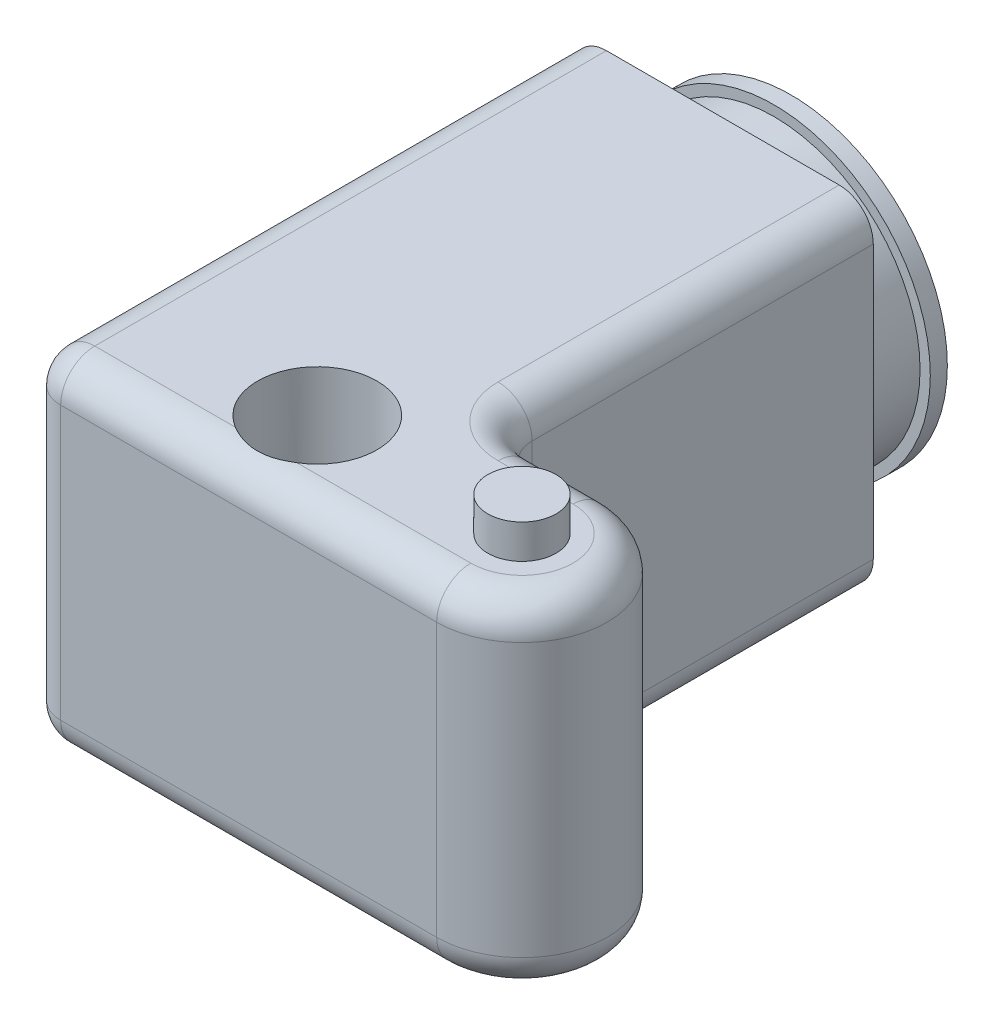
ISO-10303-21;
HEADER;
FILE_DESCRIPTION(('STEP AP214'),'2;1');
FILE_NAME('part.step','',(''),(''),'','','');
FILE_SCHEMA(('AUTOMOTIVE_DESIGN { 1 0 10303 214 1 1 1 1 }'));
ENDSEC;
DATA;
#1=APPLICATION_CONTEXT('core data for automotive mechanical design processes');
#2=APPLICATION_PROTOCOL_DEFINITION('international standard','automotive_design',2000,#1);
#3=PRODUCT_CONTEXT('',#1,'mechanical');
#4=PRODUCT('Part','Part','',(#3));
#5=PRODUCT_RELATED_PRODUCT_CATEGORY('part','',(#4));
#6=PRODUCT_DEFINITION_FORMATION('','',#4);
#7=PRODUCT_DEFINITION_CONTEXT('part definition',#1,'design');
#8=PRODUCT_DEFINITION('design','',#6,#7);
#9=PRODUCT_DEFINITION_SHAPE('','',#8);
#10=(LENGTH_UNIT() NAMED_UNIT(*) SI_UNIT(.MILLI.,.METRE.));
#11=(NAMED_UNIT(*) PLANE_ANGLE_UNIT() SI_UNIT($,.RADIAN.));
#12=(NAMED_UNIT(*) SI_UNIT($,.STERADIAN.) SOLID_ANGLE_UNIT());
#13=UNCERTAINTY_MEASURE_WITH_UNIT(LENGTH_MEASURE(1.E-05),#10,'distance_accuracy_value','');
#14=(GEOMETRIC_REPRESENTATION_CONTEXT(3) GLOBAL_UNCERTAINTY_ASSIGNED_CONTEXT((#13)) GLOBAL_UNIT_ASSIGNED_CONTEXT((#10,
#11,#12)) REPRESENTATION_CONTEXT('',''));
#15=CARTESIAN_POINT('',(0.,0.,0.));
#16=DIRECTION('',(0.,0.,1.));
#17=DIRECTION('',(1.,0.,0.));
#18=AXIS2_PLACEMENT_3D('',#15,#16,#17);
#19=CARTESIAN_POINT('',(70.2256728268984,50.,-10.391671092718));
#20=DIRECTION('',(0.,-1.,0.));
#21=DIRECTION('',(0.,0.,-1.));
#22=AXIS2_PLACEMENT_3D('',#19,#20,#21);
#23=CYLINDRICAL_SURFACE('',#22,25.);
#24=DIRECTION('',(0.,-1.,0.));
#25=VECTOR('',#24,1.);
#26=CARTESIAN_POINT('',(70.2256728268985,50.,14.608328907282));
#27=LINE('',#26,#25);
#28=CARTESIAN_POINT('',(70.2256728268985,-40.,14.608328907282));
#29=VERTEX_POINT('',#28);
#30=CARTESIAN_POINT('',(70.2256728268985,40.,14.608328907282));
#31=VERTEX_POINT('',#30);
#32=EDGE_CURVE('E188',#29,#31,#27,.F.);
#33=ORIENTED_EDGE('',*,*,#32,.F.);
#34=CARTESIAN_POINT('',(70.2256728268984,-40.,-10.391671092718));
#35=DIRECTION('',(0.,-1.,0.));
#36=DIRECTION('',(0.,0.,-1.));
#37=AXIS2_PLACEMENT_3D('',#34,#35,#36);
#38=CIRCLE('',#37,25.);
#39=CARTESIAN_POINT('',(70.2256728268983,-40.,-35.391671092718));
#40=VERTEX_POINT('',#39);
#41=EDGE_CURVE('E234',#29,#40,#38,.F.);
#42=ORIENTED_EDGE('',*,*,#41,.T.);
#43=DIRECTION('',(0.,-1.,0.));
#44=VECTOR('',#43,1.);
#45=CARTESIAN_POINT('',(70.2256728268983,50.,-35.391671092718));
#46=LINE('',#45,#44);
#47=CARTESIAN_POINT('',(70.2256728268983,40.,-35.391671092718));
#48=VERTEX_POINT('',#47);
#49=EDGE_CURVE('E408',#48,#40,#46,.T.);
#50=ORIENTED_EDGE('',*,*,#49,.F.);
#51=CARTESIAN_POINT('',(70.2256728268984,40.,-10.391671092718));
#52=DIRECTION('',(0.,-1.,0.));
#53=DIRECTION('',(0.,0.,-1.));
#54=AXIS2_PLACEMENT_3D('',#51,#52,#53);
#55=CIRCLE('',#54,25.);
#56=EDGE_CURVE('E232',#48,#31,#55,.T.);
#57=ORIENTED_EDGE('',*,*,#56,.T.);
#58=EDGE_LOOP('',(#33,#42,#50,#57));
#59=FACE_BOUND('',#58,.T.);
#60=ADVANCED_FACE('F38',(#59),#23,.T.);
#61=CARTESIAN_POINT('',(-50.,50.,-145.391671092718));
#62=DIRECTION('',(0.,0.,1.));
#63=DIRECTION('',(1.,0.,0.));
#64=AXIS2_PLACEMENT_3D('',#61,#62,#63);
#65=PLANE('',#64);
#66=CARTESIAN_POINT('',(-5.89036723285972,0.,-145.391671092718));
#67=DIRECTION('',(0.,0.,-1.));
#68=DIRECTION('',(-1.,0.,0.));
#69=AXIS2_PLACEMENT_3D('',#66,#67,#68);
#70=CIRCLE('',#69,42.828338);
#71=CARTESIAN_POINT('',(-48.7187052328597,0.,-145.391671092718));
#72=VERTEX_POINT('',#71);
#73=EDGE_CURVE('E405',#72,#72,#70,.T.);
#74=ORIENTED_EDGE('',*,*,#73,.F.);
#75=EDGE_LOOP('',(#74));
#76=FACE_BOUND('',#75,.T.);
#77=DIRECTION('',(0.,-1.,0.));
#78=VECTOR('',#77,1.);
#79=CARTESIAN_POINT('',(38.2192655342806,50.,-145.391671092718));
#80=LINE('',#79,#78);
#81=CARTESIAN_POINT('',(38.2192655342806,40.,-145.391671092718));
#82=VERTEX_POINT('',#81);
#83=CARTESIAN_POINT('',(38.2192655342806,-40.,-145.391671092718));
#84=VERTEX_POINT('',#83);
#85=EDGE_CURVE('E162',#82,#84,#80,.T.);
#86=ORIENTED_EDGE('',*,*,#85,.T.);
#87=CARTESIAN_POINT('',(28.2192655342806,-40.,-145.391671092718));
#88=DIRECTION('',(0.,0.,1.));
#89=DIRECTION('',(1.,0.,0.));
#90=AXIS2_PLACEMENT_3D('',#87,#88,#89);
#91=CIRCLE('',#90,10.);
#92=CARTESIAN_POINT('',(28.2192655342806,-50.,-145.391671092718));
#93=VERTEX_POINT('',#92);
#94=EDGE_CURVE('E168',#84,#93,#91,.F.);
#95=ORIENTED_EDGE('',*,*,#94,.T.);
#96=DIRECTION('',(-1.,0.,0.));
#97=VECTOR('',#96,1.);
#98=CARTESIAN_POINT('',(-50.,-50.,-145.391671092718));
#99=LINE('',#98,#97);
#100=CARTESIAN_POINT('',(-40.,-50.,-145.391671092718));
#101=VERTEX_POINT('',#100);
#102=EDGE_CURVE('E412',#93,#101,#99,.T.);
#103=ORIENTED_EDGE('',*,*,#102,.T.);
#104=CARTESIAN_POINT('',(-40.,-40.,-145.391671092718));
#105=DIRECTION('',(0.,0.,1.));
#106=DIRECTION('',(1.,0.,0.));
#107=AXIS2_PLACEMENT_3D('',#104,#105,#106);
#108=CIRCLE('',#107,10.);
#109=CARTESIAN_POINT('',(-50.,-40.,-145.391671092718));
#110=VERTEX_POINT('',#109);
#111=EDGE_CURVE('E169',#101,#110,#108,.F.);
#112=ORIENTED_EDGE('',*,*,#111,.T.);
#113=DIRECTION('',(0.,-1.,0.));
#114=VECTOR('',#113,1.);
#115=CARTESIAN_POINT('',(-50.,50.,-145.391671092718));
#116=LINE('',#115,#114);
#117=CARTESIAN_POINT('',(-50.,40.,-145.391671092718));
#118=VERTEX_POINT('',#117);
#119=EDGE_CURVE('E178',#118,#110,#116,.T.);
#120=ORIENTED_EDGE('',*,*,#119,.F.);
#121=CARTESIAN_POINT('',(-40.,40.,-145.391671092718));
#122=DIRECTION('',(0.,0.,1.));
#123=DIRECTION('',(1.,0.,0.));
#124=AXIS2_PLACEMENT_3D('',#121,#122,#123);
#125=CIRCLE('',#124,10.);
#126=CARTESIAN_POINT('',(-40.,50.,-145.391671092718));
#127=VERTEX_POINT('',#126);
#128=EDGE_CURVE('E186',#118,#127,#125,.F.);
#129=ORIENTED_EDGE('',*,*,#128,.T.);
#130=DIRECTION('',(-1.,0.,0.));
#131=VECTOR('',#130,1.);
#132=CARTESIAN_POINT('',(-50.,50.,-145.391671092718));
#133=LINE('',#132,#131);
#134=CARTESIAN_POINT('',(28.2192655342806,50.,-145.391671092718));
#135=VERTEX_POINT('',#134);
#136=EDGE_CURVE('E164',#135,#127,#133,.T.);
#137=ORIENTED_EDGE('',*,*,#136,.F.);
#138=CARTESIAN_POINT('',(28.2192655342806,40.,-145.391671092718));
#139=DIRECTION('',(0.,0.,1.));
#140=DIRECTION('',(1.,0.,0.));
#141=AXIS2_PLACEMENT_3D('',#138,#139,#140);
#142=CIRCLE('',#141,10.);
#143=EDGE_CURVE('E159',#135,#82,#142,.F.);
#144=ORIENTED_EDGE('',*,*,#143,.T.);
#145=EDGE_LOOP('',(#86,#95,#103,#112,#120,#129,#137,#144));
#146=FACE_BOUND('',#145,.T.);
#147=ADVANCED_FACE('F161',(#76,#146),#65,.F.);
#148=CARTESIAN_POINT('',(-50.,50.,14.6083289072825));
#149=DIRECTION('',(1.,0.,0.));
#150=DIRECTION('',(0.,0.,-1.));
#151=AXIS2_PLACEMENT_3D('',#148,#149,#150);
#152=PLANE('',#151);
#153=ORIENTED_EDGE('',*,*,#119,.T.);
#154=DIRECTION('',(0.,0.,1.));
#155=VECTOR('',#154,1.);
#156=CARTESIAN_POINT('',(-50.,-40.,14.6083289072825));
#157=LINE('',#156,#155);
#158=CARTESIAN_POINT('',(-50.,-40.,4.60832890728246));
#159=VERTEX_POINT('',#158);
#160=EDGE_CURVE('E240',#110,#159,#157,.T.);
#161=ORIENTED_EDGE('',*,*,#160,.T.);
#162=DIRECTION('',(0.,-1.,0.));
#163=VECTOR('',#162,1.);
#164=CARTESIAN_POINT('',(-50.,50.,4.60832890728246));
#165=LINE('',#164,#163);
#166=CARTESIAN_POINT('',(-50.,40.,4.60832890728246));
#167=VERTEX_POINT('',#166);
#168=EDGE_CURVE('E236',#159,#167,#165,.F.);
#169=ORIENTED_EDGE('',*,*,#168,.T.);
#170=DIRECTION('',(0.,0.,1.));
#171=VECTOR('',#170,1.);
#172=CARTESIAN_POINT('',(-50.,40.,14.6083289072825));
#173=LINE('',#172,#171);
#174=EDGE_CURVE('E238',#167,#118,#173,.F.);
#175=ORIENTED_EDGE('',*,*,#174,.T.);
#176=EDGE_LOOP('',(#153,#161,#169,#175));
#177=FACE_BOUND('',#176,.T.);
#178=ADVANCED_FACE('F305',(#177),#152,.F.);
#179=CARTESIAN_POINT('',(95.2256728268985,50.,14.6083289072819));
#180=DIRECTION('',(0.,0.,-1.));
#181=DIRECTION('',(-1.,0.,0.));
#182=AXIS2_PLACEMENT_3D('',#179,#180,#181);
#183=PLANE('',#182);
#184=DIRECTION('',(0.,-1.,0.));
#185=VECTOR('',#184,1.);
#186=CARTESIAN_POINT('',(-39.9999999999999,50.,14.6083289072825));
#187=LINE('',#186,#185);
#188=CARTESIAN_POINT('',(-39.9999999999999,40.,14.6083289072825));
#189=VERTEX_POINT('',#188);
#190=CARTESIAN_POINT('',(-39.9999999999999,-40.,14.6083289072825));
#191=VERTEX_POINT('',#190);
#192=EDGE_CURVE('E55',#189,#191,#187,.T.);
#193=ORIENTED_EDGE('',*,*,#192,.T.);
#194=DIRECTION('',(1.,0.,0.));
#195=VECTOR('',#194,1.);
#196=CARTESIAN_POINT('',(70.2256728268985,-40.,14.608328907282));
#197=LINE('',#196,#195);
#198=EDGE_CURVE('E244',#191,#29,#197,.T.);
#199=ORIENTED_EDGE('',*,*,#198,.T.);
#200=ORIENTED_EDGE('',*,*,#32,.T.);
#201=DIRECTION('',(1.,0.,0.));
#202=VECTOR('',#201,1.);
#203=CARTESIAN_POINT('',(95.2256728268985,40.,14.6083289072819));
#204=LINE('',#203,#202);
#205=EDGE_CURVE('E60',#31,#189,#204,.F.);
#206=ORIENTED_EDGE('',*,*,#205,.T.);
#207=EDGE_LOOP('',(#193,#199,#200,#206));
#208=FACE_BOUND('',#207,.T.);
#209=ADVANCED_FACE('F421',(#208),#183,.F.);
#210=CARTESIAN_POINT('',(38.2192655342802,50.,-35.3916710927179));
#211=DIRECTION('',(0.,0.,1.));
#212=DIRECTION('',(1.,0.,0.));
#213=AXIS2_PLACEMENT_3D('',#210,#211,#212);
#214=PLANE('',#213);
#215=ORIENTED_EDGE('',*,*,#49,.T.);
#216=DIRECTION('',(-1.,0.,0.));
#217=VECTOR('',#216,1.);
#218=CARTESIAN_POINT('',(38.2192655342802,-40.,-35.3916710927179));
#219=LINE('',#218,#217);
#220=CARTESIAN_POINT('',(48.2192655342802,-40.,-35.3916710927179));
#221=VERTEX_POINT('',#220);
#222=EDGE_CURVE('E229',#40,#221,#219,.T.);
#223=ORIENTED_EDGE('',*,*,#222,.T.);
#224=DIRECTION('',(0.,-1.,0.));
#225=VECTOR('',#224,1.);
#226=CARTESIAN_POINT('',(48.2192655342802,50.,-35.3916710927179));
#227=LINE('',#226,#225);
#228=CARTESIAN_POINT('',(48.2192655342802,40.,-35.3916710927179));
#229=VERTEX_POINT('',#228);
#230=EDGE_CURVE('E225',#221,#229,#227,.F.);
#231=ORIENTED_EDGE('',*,*,#230,.T.);
#232=DIRECTION('',(-1.,0.,0.));
#233=VECTOR('',#232,1.);
#234=CARTESIAN_POINT('',(38.2192655342802,40.,-35.3916710927179));
#235=LINE('',#234,#233);
#236=EDGE_CURVE('E227',#229,#48,#235,.F.);
#237=ORIENTED_EDGE('',*,*,#236,.T.);
#238=EDGE_LOOP('',(#215,#223,#231,#237));
#239=FACE_BOUND('',#238,.T.);
#240=ADVANCED_FACE('F475',(#239),#214,.F.);
#241=CARTESIAN_POINT('',(38.2192655342806,50.,-145.391671092718));
#242=DIRECTION('',(-1.,0.,0.));
#243=DIRECTION('',(0.,0.,1.));
#244=AXIS2_PLACEMENT_3D('',#241,#242,#243);
#245=PLANE('',#244);
#246=DIRECTION('',(0.,-1.,0.));
#247=VECTOR('',#246,1.);
#248=CARTESIAN_POINT('',(38.2192655342802,-50.,-45.3916710927179));
#249=LINE('',#248,#247);
#250=CARTESIAN_POINT('',(38.2192655342802,40.,-45.3916710927179));
#251=VERTEX_POINT('',#250);
#252=CARTESIAN_POINT('',(38.2192655342802,-40.,-45.3916710927179));
#253=VERTEX_POINT('',#252);
#254=EDGE_CURVE('E184',#251,#253,#249,.T.);
#255=ORIENTED_EDGE('',*,*,#254,.T.);
#256=DIRECTION('',(0.,0.,-1.));
#257=VECTOR('',#256,1.);
#258=CARTESIAN_POINT('',(38.2192655342806,-40.,-145.391671092718));
#259=LINE('',#258,#257);
#260=EDGE_CURVE('E177',#253,#84,#259,.T.);
#261=ORIENTED_EDGE('',*,*,#260,.T.);
#262=ORIENTED_EDGE('',*,*,#85,.F.);
#263=DIRECTION('',(0.,0.,-1.));
#264=VECTOR('',#263,1.);
#265=CARTESIAN_POINT('',(38.2192655342806,40.,-145.391671092718));
#266=LINE('',#265,#264);
#267=EDGE_CURVE('E174',#82,#251,#266,.F.);
#268=ORIENTED_EDGE('',*,*,#267,.T.);
#269=EDGE_LOOP('',(#255,#261,#262,#268));
#270=FACE_BOUND('',#269,.T.);
#271=ADVANCED_FACE('F173',(#270),#245,.F.);
#272=CARTESIAN_POINT('',(0.,50.,0.));
#273=DIRECTION('',(0.,-1.,0.));
#274=DIRECTION('',(0.,0.,-1.));
#275=AXIS2_PLACEMENT_3D('',#272,#273,#274);
#276=PLANE('',#275);
#277=CARTESIAN_POINT('',(70.2256728268979,50.,-10.3916710927181));
#278=DIRECTION('',(0.,-1.,0.));
#279=DIRECTION('',(0.,0.,-1.));
#280=AXIS2_PLACEMENT_3D('',#277,#278,#279);
#281=CIRCLE('',#280,9.99999999999998);
#282=CARTESIAN_POINT('',(70.2256728268979,50.,-20.3916710927181));
#283=VERTEX_POINT('',#282);
#284=EDGE_CURVE('E409',#283,#283,#281,.F.);
#285=ORIENTED_EDGE('',*,*,#284,.F.);
#286=EDGE_LOOP('',(#285));
#287=FACE_BOUND('',#286,.T.);
#288=CARTESIAN_POINT('',(48.2192655342802,50.,-45.3916710927179));
#289=DIRECTION('',(0.,-1.,0.));
#290=DIRECTION('',(0.,0.,-1.));
#291=AXIS2_PLACEMENT_3D('',#288,#289,#290);
#292=CIRCLE('',#291,20.);
#293=CARTESIAN_POINT('',(28.2192655342802,50.,-45.391671092718));
#294=VERTEX_POINT('',#293);
#295=CARTESIAN_POINT('',(48.2192655342803,50.,-25.3916710927179));
#296=VERTEX_POINT('',#295);
#297=EDGE_CURVE('E220',#294,#296,#292,.F.);
#298=ORIENTED_EDGE('',*,*,#297,.F.);
#299=DIRECTION('',(0.,0.,-1.));
#300=VECTOR('',#299,1.);
#301=CARTESIAN_POINT('',(28.21926553428,50.,1.01465435514069E-13));
#302=LINE('',#301,#300);
#303=EDGE_CURVE('E223',#294,#135,#302,.T.);
#304=ORIENTED_EDGE('',*,*,#303,.T.);
#305=ORIENTED_EDGE('',*,*,#136,.T.);
#306=DIRECTION('',(0.,0.,1.));
#307=VECTOR('',#306,1.);
#308=CARTESIAN_POINT('',(-40.,50.,0.));
#309=LINE('',#308,#307);
#310=CARTESIAN_POINT('',(-40.,50.,4.60832890728246));
#311=VERTEX_POINT('',#310);
#312=EDGE_CURVE('E210',#127,#311,#309,.T.);
#313=ORIENTED_EDGE('',*,*,#312,.T.);
#314=DIRECTION('',(1.,0.,0.));
#315=VECTOR('',#314,1.);
#316=CARTESIAN_POINT('',(0.,50.,4.6083289072823));
#317=LINE('',#316,#315);
#318=CARTESIAN_POINT('',(1.2117946382386,50.,4.6083289072823));
#319=VERTEX_POINT('',#318);
#320=EDGE_CURVE('E212',#311,#319,#317,.T.);
#321=ORIENTED_EDGE('',*,*,#320,.T.);
#322=CARTESIAN_POINT('',(10.225672826898,50.,-10.3916710927181));
#323=DIRECTION('',(0.,1.,0.));
#324=DIRECTION('',(0.,0.,1.));
#325=AXIS2_PLACEMENT_3D('',#322,#323,#324);
#326=CIRCLE('',#325,17.5);
#327=CARTESIAN_POINT('',(19.2395510155574,50.,4.60832890728222));
#328=VERTEX_POINT('',#327);
#329=EDGE_CURVE('E387',#328,#319,#326,.T.);
#330=ORIENTED_EDGE('',*,*,#329,.F.);
#331=DIRECTION('',(1.,0.,0.));
#332=VECTOR('',#331,1.);
#333=CARTESIAN_POINT('',(0.,50.,4.6083289072823));
#334=LINE('',#333,#332);
#335=CARTESIAN_POINT('',(70.2256728268985,50.,4.60832890728202));
#336=VERTEX_POINT('',#335);
#337=EDGE_CURVE('E214',#328,#336,#334,.T.);
#338=ORIENTED_EDGE('',*,*,#337,.T.);
#339=CARTESIAN_POINT('',(70.2256728268984,50.,-10.391671092718));
#340=DIRECTION('',(0.,-1.,0.));
#341=DIRECTION('',(0.,0.,-1.));
#342=AXIS2_PLACEMENT_3D('',#339,#340,#341);
#343=CIRCLE('',#342,15.);
#344=CARTESIAN_POINT('',(70.2256728268984,50.,-25.391671092718));
#345=VERTEX_POINT('',#344);
#346=EDGE_CURVE('E216',#336,#345,#343,.F.);
#347=ORIENTED_EDGE('',*,*,#346,.T.);
#348=DIRECTION('',(-1.,0.,0.));
#349=VECTOR('',#348,1.);
#350=CARTESIAN_POINT('',(0.,50.,-25.3916710927177));
#351=LINE('',#350,#349);
#352=EDGE_CURVE('E218',#345,#296,#351,.T.);
#353=ORIENTED_EDGE('',*,*,#352,.T.);
#354=EDGE_LOOP('',(#298,#304,#305,#313,#321,#330,#338,#347,#353));
#355=FACE_BOUND('',#354,.T.);
#356=ADVANCED_FACE('F428',(#287,#355),#276,.F.);
#357=CARTESIAN_POINT('',(0.,-50.,0.));
#358=DIRECTION('',(0.,-1.,0.));
#359=DIRECTION('',(0.,0.,-1.));
#360=AXIS2_PLACEMENT_3D('',#357,#358,#359);
#361=PLANE('',#360);
#362=ORIENTED_EDGE('',*,*,#102,.F.);
#363=DIRECTION('',(0.,0.,-1.));
#364=VECTOR('',#363,1.);
#365=CARTESIAN_POINT('',(28.2192655342802,-50.,-35.3916710927179));
#366=LINE('',#365,#364);
#367=CARTESIAN_POINT('',(28.2192655342802,-50.,-45.391671092718));
#368=VERTEX_POINT('',#367);
#369=EDGE_CURVE('E208',#93,#368,#366,.F.);
#370=ORIENTED_EDGE('',*,*,#369,.T.);
#371=CARTESIAN_POINT('',(48.2192655342802,-50.,-45.3916710927179));
#372=DIRECTION('',(0.,-1.,0.));
#373=DIRECTION('',(0.,0.,-1.));
#374=AXIS2_PLACEMENT_3D('',#371,#372,#373);
#375=CIRCLE('',#374,20.);
#376=CARTESIAN_POINT('',(48.2192655342803,-50.,-25.3916710927179));
#377=VERTEX_POINT('',#376);
#378=EDGE_CURVE('E205',#377,#368,#375,.T.);
#379=ORIENTED_EDGE('',*,*,#378,.F.);
#380=DIRECTION('',(-1.,0.,0.));
#381=VECTOR('',#380,1.);
#382=CARTESIAN_POINT('',(70.2256728268984,-50.,-25.391671092718));
#383=LINE('',#382,#381);
#384=CARTESIAN_POINT('',(70.2256728268984,-50.,-25.391671092718));
#385=VERTEX_POINT('',#384);
#386=EDGE_CURVE('E203',#377,#385,#383,.F.);
#387=ORIENTED_EDGE('',*,*,#386,.T.);
#388=CARTESIAN_POINT('',(70.2256728268984,-50.,-10.391671092718));
#389=DIRECTION('',(0.,-1.,0.));
#390=DIRECTION('',(0.,0.,-1.));
#391=AXIS2_PLACEMENT_3D('',#388,#389,#390);
#392=CIRCLE('',#391,15.);
#393=CARTESIAN_POINT('',(70.2256728268985,-50.,4.60832890728202));
#394=VERTEX_POINT('',#393);
#395=EDGE_CURVE('E201',#385,#394,#392,.T.);
#396=ORIENTED_EDGE('',*,*,#395,.T.);
#397=DIRECTION('',(1.,0.,0.));
#398=VECTOR('',#397,1.);
#399=CARTESIAN_POINT('',(-50.,-50.,4.6083289072825));
#400=LINE('',#399,#398);
#401=CARTESIAN_POINT('',(19.2395510155574,-50.,4.60832890728222));
#402=VERTEX_POINT('',#401);
#403=EDGE_CURVE('E199',#394,#402,#400,.F.);
#404=ORIENTED_EDGE('',*,*,#403,.T.);
#405=CARTESIAN_POINT('',(10.225672826898,-50.,-10.3916710927181));
#406=DIRECTION('',(0.,1.,0.));
#407=DIRECTION('',(0.,0.,1.));
#408=AXIS2_PLACEMENT_3D('',#405,#406,#407);
#409=CIRCLE('',#408,17.5);
#410=CARTESIAN_POINT('',(1.21179463823861,-50.,4.60832890728229));
#411=VERTEX_POINT('',#410);
#412=EDGE_CURVE('E378',#402,#411,#409,.T.);
#413=ORIENTED_EDGE('',*,*,#412,.T.);
#414=DIRECTION('',(1.,0.,0.));
#415=VECTOR('',#414,1.);
#416=CARTESIAN_POINT('',(-50.,-50.,4.6083289072825));
#417=LINE('',#416,#415);
#418=CARTESIAN_POINT('',(-40.,-50.,4.60832890728246));
#419=VERTEX_POINT('',#418);
#420=EDGE_CURVE('E195',#411,#419,#417,.F.);
#421=ORIENTED_EDGE('',*,*,#420,.T.);
#422=DIRECTION('',(0.,0.,1.));
#423=VECTOR('',#422,1.);
#424=CARTESIAN_POINT('',(-40.,-50.,-145.391671092718));
#425=LINE('',#424,#423);
#426=EDGE_CURVE('E197',#419,#101,#425,.F.);
#427=ORIENTED_EDGE('',*,*,#426,.T.);
#428=EDGE_LOOP('',(#362,#370,#379,#387,#396,#404,#413,#421,#427));
#429=FACE_BOUND('',#428,.T.);
#430=ADVANCED_FACE('F466',(#429),#361,.T.);
#431=CARTESIAN_POINT('',(70.2256728268979,60.,-10.3916710927181));
#432=DIRECTION('',(0.,-1.,0.));
#433=DIRECTION('',(0.,0.,-1.));
#434=AXIS2_PLACEMENT_3D('',#431,#432,#433);
#435=CYLINDRICAL_SURFACE('',#434,9.99999999999998);
#436=CARTESIAN_POINT('',(70.2256728268979,60.,-10.3916710927181));
#437=DIRECTION('',(0.,1.,0.));
#438=DIRECTION('',(0.,0.,1.));
#439=AXIS2_PLACEMENT_3D('',#436,#437,#438);
#440=CIRCLE('',#439,9.99999999999998);
#441=CARTESIAN_POINT('',(70.2256728268979,60.,-0.391671092718102));
#442=VERTEX_POINT('',#441);
#443=EDGE_CURVE('E404',#442,#442,#440,.T.);
#444=ORIENTED_EDGE('',*,*,#443,.F.);
#445=EDGE_LOOP('',(#444));
#446=FACE_BOUND('',#445,.T.);
#447=ORIENTED_EDGE('',*,*,#284,.T.);
#448=EDGE_LOOP('',(#447));
#449=FACE_BOUND('',#448,.T.);
#450=ADVANCED_FACE('F462',(#446,#449),#435,.T.);
#451=CARTESIAN_POINT('',(70.2256728268979,60.,-10.3916710927181));
#452=DIRECTION('',(0.,1.,0.));
#453=DIRECTION('',(0.,0.,1.));
#454=AXIS2_PLACEMENT_3D('',#451,#452,#453);
#455=PLANE('',#454);
#456=ORIENTED_EDGE('',*,*,#443,.T.);
#457=EDGE_LOOP('',(#456));
#458=FACE_BOUND('',#457,.T.);
#459=ADVANCED_FACE('F458',(#458),#455,.T.);
#460=CARTESIAN_POINT('',(-5.89036723285972,0.,-160.391671092718));
#461=DIRECTION('',(0.,0.,1.));
#462=DIRECTION('',(1.,0.,0.));
#463=AXIS2_PLACEMENT_3D('',#460,#461,#462);
#464=CYLINDRICAL_SURFACE('',#463,42.828338);
#465=CARTESIAN_POINT('',(-5.89036723285972,0.,-160.391671092718));
#466=DIRECTION('',(0.,0.,-1.));
#467=DIRECTION('',(-1.,0.,0.));
#468=AXIS2_PLACEMENT_3D('',#465,#466,#467);
#469=CIRCLE('',#468,42.828338);
#470=CARTESIAN_POINT('',(-48.7187052328597,0.,-160.391671092718));
#471=VERTEX_POINT('',#470);
#472=EDGE_CURVE('E399',#471,#471,#469,.T.);
#473=ORIENTED_EDGE('',*,*,#472,.F.);
#474=EDGE_LOOP('',(#473));
#475=FACE_BOUND('',#474,.T.);
#476=ORIENTED_EDGE('',*,*,#73,.T.);
#477=EDGE_LOOP('',(#476));
#478=FACE_BOUND('',#477,.T.);
#479=ADVANCED_FACE('F454',(#475,#478),#464,.T.);
#480=CARTESIAN_POINT('',(-5.89036723285972,0.,-165.391671092718));
#481=DIRECTION('',(0.,0.,1.));
#482=DIRECTION('',(1.,0.,0.));
#483=AXIS2_PLACEMENT_3D('',#480,#481,#482);
#484=CYLINDRICAL_SURFACE('',#483,45.828338);
#485=CARTESIAN_POINT('',(-5.89036723285972,0.,-165.391671092718));
#486=DIRECTION('',(0.,0.,-1.));
#487=DIRECTION('',(-1.,0.,0.));
#488=AXIS2_PLACEMENT_3D('',#485,#486,#487);
#489=CIRCLE('',#488,45.828338);
#490=CARTESIAN_POINT('',(-51.7187052328597,0.,-165.391671092718));
#491=VERTEX_POINT('',#490);
#492=EDGE_CURVE('E396',#491,#491,#489,.T.);
#493=ORIENTED_EDGE('',*,*,#492,.F.);
#494=EDGE_LOOP('',(#493));
#495=FACE_BOUND('',#494,.T.);
#496=CARTESIAN_POINT('',(-5.89036723285972,0.,-160.391671092718));
#497=DIRECTION('',(0.,0.,-1.));
#498=DIRECTION('',(-1.,0.,0.));
#499=AXIS2_PLACEMENT_3D('',#496,#497,#498);
#500=CIRCLE('',#499,45.828338);
#501=CARTESIAN_POINT('',(-51.7187052328597,0.,-160.391671092718));
#502=VERTEX_POINT('',#501);
#503=EDGE_CURVE('E393',#502,#502,#500,.T.);
#504=ORIENTED_EDGE('',*,*,#503,.T.);
#505=EDGE_LOOP('',(#504));
#506=FACE_BOUND('',#505,.T.);
#507=ADVANCED_FACE('F449',(#495,#506),#484,.T.);
#508=CARTESIAN_POINT('',(-5.89036723285972,0.,-165.391671092718));
#509=DIRECTION('',(0.,0.,-1.));
#510=DIRECTION('',(-1.,0.,0.));
#511=AXIS2_PLACEMENT_3D('',#508,#509,#510);
#512=PLANE('',#511);
#513=ORIENTED_EDGE('',*,*,#492,.T.);
#514=EDGE_LOOP('',(#513));
#515=FACE_BOUND('',#514,.T.);
#516=ADVANCED_FACE('F442',(#515),#512,.T.);
#517=CARTESIAN_POINT('',(-5.89036723285972,0.,-160.391671092718));
#518=DIRECTION('',(0.,0.,-1.));
#519=DIRECTION('',(-1.,0.,0.));
#520=AXIS2_PLACEMENT_3D('',#517,#518,#519);
#521=PLANE('',#520);
#522=ORIENTED_EDGE('',*,*,#472,.T.);
#523=EDGE_LOOP('',(#522));
#524=FACE_BOUND('',#523,.T.);
#525=ORIENTED_EDGE('',*,*,#503,.F.);
#526=EDGE_LOOP('',(#525));
#527=FACE_BOUND('',#526,.T.);
#528=ADVANCED_FACE('F435',(#524,#527),#521,.F.);
#529=CARTESIAN_POINT('',(10.225672826898,25.,-10.3916710927181));
#530=DIRECTION('',(0.,1.,0.));
#531=DIRECTION('',(0.,0.,1.));
#532=AXIS2_PLACEMENT_3D('',#529,#530,#531);
#533=CYLINDRICAL_SURFACE('',#532,17.5);
#534=CARTESIAN_POINT('',(10.225672826898,25.,-10.3916710927181));
#535=DIRECTION('',(0.,1.,0.));
#536=DIRECTION('',(0.,0.,1.));
#537=AXIS2_PLACEMENT_3D('',#534,#535,#536);
#538=CIRCLE('',#537,17.5);
#539=CARTESIAN_POINT('',(10.225672826898,25.,7.10832890728192));
#540=VERTEX_POINT('',#539);
#541=EDGE_CURVE('E390',#540,#540,#538,.T.);
#542=ORIENTED_EDGE('',*,*,#541,.F.);
#543=EDGE_LOOP('',(#542));
#544=FACE_BOUND('',#543,.T.);
#545=ORIENTED_EDGE('',*,*,#329,.T.);
#546=CARTESIAN_POINT('',(1.21179463823861,50.,4.60832890728229));
#547=CARTESIAN_POINT('',(1.39300804491676,49.9999957126868,4.71722531671523));
#548=CARTESIAN_POINT('',(1.57617100039989,49.9982217732126,4.82282174777108));
#549=CARTESIAN_POINT('',(1.94614671749729,49.9917443642546,5.0272820555433));
#550=CARTESIAN_POINT('',(2.1329591580426,49.9870411513638,5.12614652111242));
#551=CARTESIAN_POINT('',(2.69833007966335,49.9694582413273,5.41236207135774));
#552=CARTESIAN_POINT('',(3.08202924632987,49.953103876887,5.58945970921827));
#553=CARTESIAN_POINT('',(3.86143952808305,49.915551699231,5.91554372100384));
#554=CARTESIAN_POINT('',(4.25716446783772,49.8943481135142,6.06449620194474));
#555=CARTESIAN_POINT('',(5.05837869659924,49.8510257077792,6.33338978342092));
#556=CARTESIAN_POINT('',(5.46386973354242,49.8289067234064,6.45332564749092));
#557=CARTESIAN_POINT('',(6.34117640078786,49.784123640792,6.67859637561513));
#558=CARTESIAN_POINT('',(6.81418497528248,49.761833854221,6.77939113556774));
#559=CARTESIAN_POINT('',(7.76721660845125,49.724357876697,6.94152375859449));
#560=CARTESIAN_POINT('',(8.24723994803689,49.7091719710324,7.00286003707166));
#561=CARTESIAN_POINT('',(9.21072292350071,49.6884039733486,7.08555797946984));
#562=CARTESIAN_POINT('',(9.69418092051859,49.6828175742871,7.10693757126712));
#563=CARTESIAN_POINT('',(10.6611901976624,49.682133133711,7.10958865574882));
#564=CARTESIAN_POINT('',(11.1447414719246,49.6870345684662,7.09086215120801));
#565=CARTESIAN_POINT('',(12.1065740173681,49.7065001655335,7.01361835649541));
#566=CARTESIAN_POINT('',(12.5848684016387,49.7210271099358,6.95525430688067));
#567=CARTESIAN_POINT('',(13.5348071858718,49.7573456098688,6.79935416738088));
#568=CARTESIAN_POINT('',(14.0064505923438,49.7791382389781,6.70181228813747));
#569=CARTESIAN_POINT('',(14.9396499205166,49.8262170707904,6.46833047179405));
#570=CARTESIAN_POINT('',(15.4012115153136,49.8515012468909,6.33241276175617));
#571=CARTESIAN_POINT('',(16.3114652246089,49.9006558850025,6.0230806121526));
#572=CARTESIAN_POINT('',(16.7601629520511,49.9245269685887,5.84968281739149));
#573=CARTESIAN_POINT('',(17.5519719370346,49.9608460677786,5.50555245081073));
#574=CARTESIAN_POINT('',(17.8979333240852,49.9746313273788,5.34150678918078));
#575=CARTESIAN_POINT('',(18.4080389063746,49.9893106260572,5.07879732350479));
#576=CARTESIAN_POINT('',(18.5764609372305,49.9932031870331,4.98853837383376));
#577=CARTESIAN_POINT('',(18.9103051662442,49.9985464854461,4.80252785861871));
#578=CARTESIAN_POINT('',(19.075727053174,49.9999969709653,4.70677572746597));
#579=CARTESIAN_POINT('',(19.2395510155574,50.,4.60832890728223));
#580=B_SPLINE_CURVE_WITH_KNOTS('',3,(#546,#547,#548,#549,#550,#551,#552,#553,#554,#555,#556,
#557,#558,#559,#560,#561,#562,#563,#564,#565,#566,#567,#568,#569,#570,#571,#572,#573,#574,#575,
#576,#577,#578,#579),.UNSPECIFIED.,.F.,.F.,(4,2,2,2,2,2,2,2,2,2,2,2,2,2,2,2,4),(0.,
0.634154090419685,1.26825263920741,2.53572691158068,3.80471790888149,5.07393774329687,
6.52464544054446,7.97541139253072,9.42552625443304,10.8755687037595,12.3200368969611,
13.7647186196659,15.2085653014238,16.6517720873654,17.800257626713,18.3735197147518,
18.946840935376),.UNSPECIFIED.);
#581=EDGE_CURVE('E11',#319,#328,#580,.T.);
#582=ORIENTED_EDGE('',*,*,#581,.T.);
#583=EDGE_LOOP('',(#545,#582));
#584=FACE_BOUND('',#583,.T.);
#585=ADVANCED_FACE('F432',(#544,#584),#533,.F.);
#586=CARTESIAN_POINT('',(10.225672826898,25.,-10.3916710927181));
#587=DIRECTION('',(0.,1.,0.));
#588=DIRECTION('',(0.,0.,1.));
#589=AXIS2_PLACEMENT_3D('',#586,#587,#588);
#590=PLANE('',#589);
#591=ORIENTED_EDGE('',*,*,#541,.T.);
#592=EDGE_LOOP('',(#591));
#593=FACE_BOUND('',#592,.T.);
#594=ADVANCED_FACE('F434',(#593),#590,.T.);
#595=CARTESIAN_POINT('',(10.225672826898,-25.,-10.3916710927181));
#596=DIRECTION('',(0.,-1.,0.));
#597=DIRECTION('',(0.,0.,-1.));
#598=AXIS2_PLACEMENT_3D('',#595,#596,#597);
#599=CYLINDRICAL_SURFACE('',#598,17.5);
#600=CARTESIAN_POINT('',(10.225672826898,-25.,-10.3916710927181));
#601=DIRECTION('',(0.,1.,0.));
#602=DIRECTION('',(0.,0.,1.));
#603=AXIS2_PLACEMENT_3D('',#600,#601,#602);
#604=CIRCLE('',#603,17.5);
#605=CARTESIAN_POINT('',(10.225672826898,-25.,7.10832890728192));
#606=VERTEX_POINT('',#605);
#607=EDGE_CURVE('E381',#606,#606,#604,.T.);
#608=ORIENTED_EDGE('',*,*,#607,.T.);
#609=EDGE_LOOP('',(#608));
#610=FACE_BOUND('',#609,.T.);
#611=ORIENTED_EDGE('',*,*,#412,.F.);
#612=CARTESIAN_POINT('',(19.2395510155574,-50.,4.60832890728222));
#613=CARTESIAN_POINT('',(19.0583376088793,-49.9999957126868,4.71722531671516));
#614=CARTESIAN_POINT('',(18.8751746533962,-49.9982217732126,4.82282174777101));
#615=CARTESIAN_POINT('',(18.5051989362988,-49.9917443642545,5.02728205554324));
#616=CARTESIAN_POINT('',(18.3183864957534,-49.9870411513638,5.12614652111235));
#617=CARTESIAN_POINT('',(17.7530155741327,-49.9694582413273,5.41236207135768));
#618=CARTESIAN_POINT('',(17.3693164074662,-49.953103876887,5.58945970921822));
#619=CARTESIAN_POINT('',(16.589906125713,-49.915551699231,5.91554372100379));
#620=CARTESIAN_POINT('',(16.1941811859583,-49.8943481135142,6.06449620194469));
#621=CARTESIAN_POINT('',(15.3929669571968,-49.8510257077792,6.33338978342088));
#622=CARTESIAN_POINT('',(14.9874759202536,-49.8289067234064,6.45332564749088));
#623=CARTESIAN_POINT('',(14.1101692530082,-49.7841236407919,6.6785963756151));
#624=CARTESIAN_POINT('',(13.6371606785136,-49.761833854221,6.77939113556771));
#625=CARTESIAN_POINT('',(12.6841290453448,-49.724357876697,6.94152375859447));
#626=CARTESIAN_POINT('',(12.2041057057592,-49.7091719710323,7.00286003707165));
#627=CARTESIAN_POINT('',(11.2406227302953,-49.6884039733486,7.08555797946983));
#628=CARTESIAN_POINT('',(10.7571647332775,-49.6828175742871,7.10693757126712));
#629=CARTESIAN_POINT('',(9.79015545613368,-49.6821331337109,7.10958865574882));
#630=CARTESIAN_POINT('',(9.30660418187147,-49.6870345684662,7.09086215120802));
#631=CARTESIAN_POINT('',(8.34477163642796,-49.7065001655335,7.01361835649543));
#632=CARTESIAN_POINT('',(7.8664772521573,-49.7210271099358,6.95525430688068));
#633=CARTESIAN_POINT('',(6.91653846792425,-49.7573456098688,6.7993541673809));
#634=CARTESIAN_POINT('',(6.44489506145226,-49.7791382389781,6.70181228813749));
#635=CARTESIAN_POINT('',(5.51169573327946,-49.8262170707904,6.46833047179409));
#636=CARTESIAN_POINT('',(5.05013413848247,-49.8515012468909,6.33241276175621));
#637=CARTESIAN_POINT('',(4.13988042918713,-49.9006558850025,6.02308061215265));
#638=CARTESIAN_POINT('',(3.6911827017449,-49.9245269685887,5.84968281739154));
#639=CARTESIAN_POINT('',(2.8993737167614,-49.9608460677785,5.50555245081078));
#640=CARTESIAN_POINT('',(2.55341232971081,-49.9746313273788,5.34150678918083));
#641=CARTESIAN_POINT('',(2.04330674742145,-49.9893106260572,5.07879732350485));
#642=CARTESIAN_POINT('',(1.87488471656549,-49.993203187033,4.98853837383383));
#643=CARTESIAN_POINT('',(1.54104048755184,-49.9985464854461,4.80252785861878));
#644=CARTESIAN_POINT('',(1.37561860062206,-49.9999969709653,4.70677572746604));
#645=CARTESIAN_POINT('',(1.21179463823861,-50.,4.60832890728229));
#646=B_SPLINE_CURVE_WITH_KNOTS('',3,(#612,#613,#614,#615,#616,#617,#618,#619,#620,#621,#622,
#623,#624,#625,#626,#627,#628,#629,#630,#631,#632,#633,#634,#635,#636,#637,#638,#639,#640,#641,
#642,#643,#644,#645),.UNSPECIFIED.,.F.,.F.,(4,2,2,2,2,2,2,2,2,2,2,2,2,2,2,2,4),(0.,
0.634154090419687,1.26825263920741,2.53572691158068,3.80471790888149,5.07393774329687,
6.52464544054446,7.97541139253071,9.42552625443304,10.8755687037595,12.3200368969611,
13.7647186196659,15.2085653014237,16.6517720873654,17.800257626713,18.3735197147518,
18.946840935376),.UNSPECIFIED.);
#647=EDGE_CURVE('E47',#402,#411,#646,.T.);
#648=ORIENTED_EDGE('',*,*,#647,.T.);
#649=EDGE_LOOP('',(#611,#648));
#650=FACE_BOUND('',#649,.T.);
#651=ADVANCED_FACE('F259',(#610,#650),#599,.F.);
#652=CARTESIAN_POINT('',(10.225672826898,-25.,-10.3916710927181));
#653=DIRECTION('',(0.,-1.,0.));
#654=DIRECTION('',(0.,0.,1.));
#655=AXIS2_PLACEMENT_3D('',#652,#653,#654);
#656=PLANE('',#655);
#657=ORIENTED_EDGE('',*,*,#607,.F.);
#658=EDGE_LOOP('',(#657));
#659=FACE_BOUND('',#658,.T.);
#660=ADVANCED_FACE('F296',(#659),#656,.T.);
#661=CARTESIAN_POINT('',(-40.,40.,0.));
#662=DIRECTION('',(0.,0.,1.));
#663=DIRECTION('',(1.,0.,0.));
#664=AXIS2_PLACEMENT_3D('',#661,#662,#663);
#665=CYLINDRICAL_SURFACE('',#664,10.);
#666=CARTESIAN_POINT('',(-40.,40.,4.60832890728246));
#667=DIRECTION('',(0.,0.,1.));
#668=DIRECTION('',(1.,0.,0.));
#669=AXIS2_PLACEMENT_3D('',#666,#667,#668);
#670=CIRCLE('',#669,10.);
#671=EDGE_CURVE('E42',#311,#167,#670,.T.);
#672=ORIENTED_EDGE('',*,*,#671,.F.);
#673=ORIENTED_EDGE('',*,*,#312,.F.);
#674=ORIENTED_EDGE('',*,*,#128,.F.);
#675=ORIENTED_EDGE('',*,*,#174,.F.);
#676=EDGE_LOOP('',(#672,#673,#674,#675));
#677=FACE_BOUND('',#676,.T.);
#678=ADVANCED_FACE('F40',(#677),#665,.T.);
#679=CARTESIAN_POINT('',(-40.,40.,4.60832890728246));
#680=DIRECTION('',(0.,0.,1.));
#681=DIRECTION('',(1.,0.,0.));
#682=AXIS2_PLACEMENT_3D('',#679,#680,#681);
#683=SPHERICAL_SURFACE('',#682,10.);
#684=CARTESIAN_POINT('',(-40.,40.,4.60832890728246));
#685=DIRECTION('',(-1.,0.,0.));
#686=DIRECTION('',(0.,0.,1.));
#687=AXIS2_PLACEMENT_3D('',#684,#685,#686);
#688=CIRCLE('',#687,10.);
#689=EDGE_CURVE('E372',#311,#189,#688,.F.);
#690=ORIENTED_EDGE('',*,*,#689,.F.);
#691=ORIENTED_EDGE('',*,*,#671,.T.);
#692=CARTESIAN_POINT('',(-40.,40.,4.60832890728246));
#693=DIRECTION('',(0.,1.,0.));
#694=DIRECTION('',(0.,0.,1.));
#695=AXIS2_PLACEMENT_3D('',#692,#693,#694);
#696=CIRCLE('',#695,10.);
#697=EDGE_CURVE('E373',#189,#167,#696,.F.);
#698=ORIENTED_EDGE('',*,*,#697,.F.);
#699=EDGE_LOOP('',(#690,#691,#698));
#700=FACE_BOUND('',#699,.T.);
#701=ADVANCED_FACE('F289',(#700),#683,.T.);
#702=CARTESIAN_POINT('',(-40.,-40.,14.6083289072825));
#703=DIRECTION('',(0.,0.,-1.));
#704=DIRECTION('',(-1.,0.,0.));
#705=AXIS2_PLACEMENT_3D('',#702,#703,#704);
#706=CYLINDRICAL_SURFACE('',#705,10.);
#707=ORIENTED_EDGE('',*,*,#111,.F.);
#708=ORIENTED_EDGE('',*,*,#426,.F.);
#709=CARTESIAN_POINT('',(-40.,-40.,4.60832890728246));
#710=DIRECTION('',(0.,0.,1.));
#711=DIRECTION('',(1.,0.,0.));
#712=AXIS2_PLACEMENT_3D('',#709,#710,#711);
#713=CIRCLE('',#712,10.);
#714=EDGE_CURVE('E369',#159,#419,#713,.T.);
#715=ORIENTED_EDGE('',*,*,#714,.F.);
#716=ORIENTED_EDGE('',*,*,#160,.F.);
#717=EDGE_LOOP('',(#707,#708,#715,#716));
#718=FACE_BOUND('',#717,.T.);
#719=ADVANCED_FACE('F286',(#718),#706,.T.);
#720=CARTESIAN_POINT('',(-40.,50.,4.60832890728246));
#721=DIRECTION('',(0.,-1.,0.));
#722=DIRECTION('',(0.,0.,-1.));
#723=AXIS2_PLACEMENT_3D('',#720,#721,#722);
#724=CYLINDRICAL_SURFACE('',#723,10.);
#725=ORIENTED_EDGE('',*,*,#697,.T.);
#726=ORIENTED_EDGE('',*,*,#168,.F.);
#727=CARTESIAN_POINT('',(-40.,-40.,4.60832890728246));
#728=DIRECTION('',(0.,-1.,0.));
#729=DIRECTION('',(0.,0.,-1.));
#730=AXIS2_PLACEMENT_3D('',#727,#728,#729);
#731=CIRCLE('',#730,10.);
#732=EDGE_CURVE('E366',#191,#159,#731,.T.);
#733=ORIENTED_EDGE('',*,*,#732,.F.);
#734=ORIENTED_EDGE('',*,*,#192,.F.);
#735=EDGE_LOOP('',(#725,#726,#733,#734));
#736=FACE_BOUND('',#735,.T.);
#737=ADVANCED_FACE('F282',(#736),#724,.T.);
#738=CARTESIAN_POINT('',(0.,40.,4.6083289072823));
#739=DIRECTION('',(1.,0.,0.));
#740=DIRECTION('',(0.,0.,-1.));
#741=AXIS2_PLACEMENT_3D('',#738,#739,#740);
#742=CYLINDRICAL_SURFACE('',#741,10.);
#743=ORIENTED_EDGE('',*,*,#689,.T.);
#744=ORIENTED_EDGE('',*,*,#205,.F.);
#745=CARTESIAN_POINT('',(70.2256728268985,40.,4.60832890728202));
#746=DIRECTION('',(1.,0.,0.));
#747=DIRECTION('',(0.,0.,-1.));
#748=AXIS2_PLACEMENT_3D('',#745,#746,#747);
#749=CIRCLE('',#748,10.);
#750=EDGE_CURVE('E357',#336,#31,#749,.T.);
#751=ORIENTED_EDGE('',*,*,#750,.F.);
#752=ORIENTED_EDGE('',*,*,#337,.F.);
#753=ORIENTED_EDGE('',*,*,#581,.F.);
#754=ORIENTED_EDGE('',*,*,#320,.F.);
#755=EDGE_LOOP('',(#743,#744,#751,#752,#753,#754));
#756=FACE_BOUND('',#755,.T.);
#757=ADVANCED_FACE('F277',(#756),#742,.T.);
#758=CARTESIAN_POINT('',(-40.,-40.,4.60832890728246));
#759=DIRECTION('',(0.,0.,1.));
#760=DIRECTION('',(1.,0.,0.));
#761=AXIS2_PLACEMENT_3D('',#758,#759,#760);
#762=SPHERICAL_SURFACE('',#761,10.);
#763=ORIENTED_EDGE('',*,*,#732,.T.);
#764=ORIENTED_EDGE('',*,*,#714,.T.);
#765=CARTESIAN_POINT('',(-40.,-40.,4.60832890728246));
#766=DIRECTION('',(-1.,0.,0.));
#767=DIRECTION('',(0.,0.,1.));
#768=AXIS2_PLACEMENT_3D('',#765,#766,#767);
#769=CIRCLE('',#768,10.);
#770=EDGE_CURVE('E353',#191,#419,#769,.F.);
#771=ORIENTED_EDGE('',*,*,#770,.F.);
#772=EDGE_LOOP('',(#763,#764,#771));
#773=FACE_BOUND('',#772,.T.);
#774=ADVANCED_FACE('F274',(#773),#762,.T.);
#775=CARTESIAN_POINT('',(70.2256728268984,40.,-10.391671092718));
#776=DIRECTION('',(0.,-1.,0.));
#777=DIRECTION('',(0.,0.,-1.));
#778=AXIS2_PLACEMENT_3D('',#775,#776,#777);
#779=TOROIDAL_SURFACE('',#778,15.,10.);
#780=ORIENTED_EDGE('',*,*,#750,.T.);
#781=ORIENTED_EDGE('',*,*,#56,.F.);
#782=CARTESIAN_POINT('',(70.2256728268984,40.,-25.391671092718));
#783=DIRECTION('',(-1.,0.,0.));
#784=DIRECTION('',(0.,0.,1.));
#785=AXIS2_PLACEMENT_3D('',#782,#783,#784);
#786=CIRCLE('',#785,10.);
#787=EDGE_CURVE('E348',#345,#48,#786,.T.);
#788=ORIENTED_EDGE('',*,*,#787,.F.);
#789=ORIENTED_EDGE('',*,*,#346,.F.);
#790=EDGE_LOOP('',(#780,#781,#788,#789));
#791=FACE_BOUND('',#790,.T.);
#792=ADVANCED_FACE('F269',(#791),#779,.T.);
#793=CARTESIAN_POINT('',(95.2256728268985,-40.,4.60832890728192));
#794=DIRECTION('',(-1.,0.,0.));
#795=DIRECTION('',(0.,0.,1.));
#796=AXIS2_PLACEMENT_3D('',#793,#794,#795);
#797=CYLINDRICAL_SURFACE('',#796,10.);
#798=ORIENTED_EDGE('',*,*,#647,.F.);
#799=ORIENTED_EDGE('',*,*,#403,.F.);
#800=CARTESIAN_POINT('',(70.2256728268985,-40.,4.60832890728202));
#801=DIRECTION('',(1.,0.,0.));
#802=DIRECTION('',(0.,0.,-1.));
#803=AXIS2_PLACEMENT_3D('',#800,#801,#802);
#804=CIRCLE('',#803,10.);
#805=EDGE_CURVE('E354',#29,#394,#804,.T.);
#806=ORIENTED_EDGE('',*,*,#805,.F.);
#807=ORIENTED_EDGE('',*,*,#198,.F.);
#808=ORIENTED_EDGE('',*,*,#770,.T.);
#809=ORIENTED_EDGE('',*,*,#420,.F.);
#810=EDGE_LOOP('',(#798,#799,#806,#807,#808,#809));
#811=FACE_BOUND('',#810,.T.);
#812=ADVANCED_FACE('F263',(#811),#797,.T.);
#813=CARTESIAN_POINT('',(0.,40.,-25.3916710927177));
#814=DIRECTION('',(-1.,0.,0.));
#815=DIRECTION('',(0.,0.,1.));
#816=AXIS2_PLACEMENT_3D('',#813,#814,#815);
#817=CYLINDRICAL_SURFACE('',#816,10.);
#818=ORIENTED_EDGE('',*,*,#787,.T.);
#819=ORIENTED_EDGE('',*,*,#236,.F.);
#820=CARTESIAN_POINT('',(48.2192655342803,40.,-25.3916710927179));
#821=DIRECTION('',(-1.,0.,0.));
#822=DIRECTION('',(0.,0.,1.));
#823=AXIS2_PLACEMENT_3D('',#820,#821,#822);
#824=CIRCLE('',#823,10.);
#825=EDGE_CURVE('E360',#296,#229,#824,.T.);
#826=ORIENTED_EDGE('',*,*,#825,.F.);
#827=ORIENTED_EDGE('',*,*,#352,.F.);
#828=EDGE_LOOP('',(#818,#819,#826,#827));
#829=FACE_BOUND('',#828,.T.);
#830=ADVANCED_FACE('F268',(#829),#817,.T.);
#831=CARTESIAN_POINT('',(28.21926553428,40.,1.01465435514069E-13));
#832=DIRECTION('',(0.,0.,-1.));
#833=DIRECTION('',(-1.,0.,0.));
#834=AXIS2_PLACEMENT_3D('',#831,#832,#833);
#835=CYLINDRICAL_SURFACE('',#834,10.);
#836=ORIENTED_EDGE('',*,*,#143,.F.);
#837=ORIENTED_EDGE('',*,*,#303,.F.);
#838=CARTESIAN_POINT('',(28.2192655342802,40.,-45.391671092718));
#839=DIRECTION('',(0.,0.,1.));
#840=DIRECTION('',(1.,0.,0.));
#841=AXIS2_PLACEMENT_3D('',#838,#839,#840);
#842=CIRCLE('',#841,10.);
#843=EDGE_CURVE('E182',#251,#294,#842,.T.);
#844=ORIENTED_EDGE('',*,*,#843,.F.);
#845=ORIENTED_EDGE('',*,*,#267,.F.);
#846=EDGE_LOOP('',(#836,#837,#844,#845));
#847=FACE_BOUND('',#846,.T.);
#848=ADVANCED_FACE('F180',(#847),#835,.T.);
#849=CARTESIAN_POINT('',(70.2256728268984,-40.,-10.391671092718));
#850=DIRECTION('',(0.,-1.,0.));
#851=DIRECTION('',(0.,0.,-1.));
#852=AXIS2_PLACEMENT_3D('',#849,#850,#851);
#853=TOROIDAL_SURFACE('',#852,15.,10.);
#854=ORIENTED_EDGE('',*,*,#805,.T.);
#855=ORIENTED_EDGE('',*,*,#395,.F.);
#856=CARTESIAN_POINT('',(70.2256728268984,-40.,-25.391671092718));
#857=DIRECTION('',(-1.,0.,0.));
#858=DIRECTION('',(0.,0.,1.));
#859=AXIS2_PLACEMENT_3D('',#856,#857,#858);
#860=CIRCLE('',#859,10.);
#861=EDGE_CURVE('E496',#40,#385,#860,.T.);
#862=ORIENTED_EDGE('',*,*,#861,.F.);
#863=ORIENTED_EDGE('',*,*,#41,.F.);
#864=EDGE_LOOP('',(#854,#855,#862,#863));
#865=FACE_BOUND('',#864,.T.);
#866=ADVANCED_FACE('F333',(#865),#853,.T.);
#867=CARTESIAN_POINT('',(48.2192655342802,40.,-45.3916710927179));
#868=DIRECTION('',(0.,-1.,0.));
#869=DIRECTION('',(0.,0.,-1.));
#870=AXIS2_PLACEMENT_3D('',#867,#868,#869);
#871=TOROIDAL_SURFACE('',#870,20.,10.);
#872=ORIENTED_EDGE('',*,*,#297,.T.);
#873=ORIENTED_EDGE('',*,*,#825,.T.);
#874=CARTESIAN_POINT('',(48.2192655342802,40.,-45.3916710927179));
#875=DIRECTION('',(0.,-1.,0.));
#876=DIRECTION('',(0.,0.,-1.));
#877=AXIS2_PLACEMENT_3D('',#874,#875,#876);
#878=CIRCLE('',#877,10.);
#879=EDGE_CURVE('E494',#251,#229,#878,.F.);
#880=ORIENTED_EDGE('',*,*,#879,.F.);
#881=ORIENTED_EDGE('',*,*,#843,.T.);
#882=EDGE_LOOP('',(#872,#873,#880,#881));
#883=FACE_BOUND('',#882,.T.);
#884=ADVANCED_FACE('F329',(#883),#871,.T.);
#885=CARTESIAN_POINT('',(38.2192655342802,-40.,-25.3916710927179));
#886=DIRECTION('',(1.,0.,0.));
#887=DIRECTION('',(0.,0.,-1.));
#888=AXIS2_PLACEMENT_3D('',#885,#886,#887);
#889=CYLINDRICAL_SURFACE('',#888,10.);
#890=ORIENTED_EDGE('',*,*,#861,.T.);
#891=ORIENTED_EDGE('',*,*,#386,.F.);
#892=CARTESIAN_POINT('',(48.2192655342803,-40.,-25.3916710927179));
#893=DIRECTION('',(-1.,0.,0.));
#894=DIRECTION('',(0.,0.,1.));
#895=AXIS2_PLACEMENT_3D('',#892,#893,#894);
#896=CIRCLE('',#895,10.);
#897=EDGE_CURVE('E502',#221,#377,#896,.T.);
#898=ORIENTED_EDGE('',*,*,#897,.F.);
#899=ORIENTED_EDGE('',*,*,#222,.F.);
#900=EDGE_LOOP('',(#890,#891,#898,#899));
#901=FACE_BOUND('',#900,.T.);
#902=ADVANCED_FACE('F325',(#901),#889,.T.);
#903=CARTESIAN_POINT('',(48.2192655342802,50.,-45.3916710927179));
#904=DIRECTION('',(0.,1.,0.));
#905=DIRECTION('',(0.,0.,1.));
#906=AXIS2_PLACEMENT_3D('',#903,#904,#905);
#907=CYLINDRICAL_SURFACE('',#906,10.);
#908=ORIENTED_EDGE('',*,*,#879,.T.);
#909=ORIENTED_EDGE('',*,*,#230,.F.);
#910=CARTESIAN_POINT('',(48.2192655342802,-40.,-45.3916710927179));
#911=DIRECTION('',(0.,-1.,0.));
#912=DIRECTION('',(0.,0.,-1.));
#913=AXIS2_PLACEMENT_3D('',#910,#911,#912);
#914=CIRCLE('',#913,10.);
#915=EDGE_CURVE('E505',#253,#221,#914,.F.);
#916=ORIENTED_EDGE('',*,*,#915,.F.);
#917=ORIENTED_EDGE('',*,*,#254,.F.);
#918=EDGE_LOOP('',(#908,#909,#916,#917));
#919=FACE_BOUND('',#918,.T.);
#920=ADVANCED_FACE('F321',(#919),#907,.F.);
#921=CARTESIAN_POINT('',(48.2192655342802,-40.,-45.3916710927179));
#922=DIRECTION('',(0.,-1.,0.));
#923=DIRECTION('',(0.,0.,-1.));
#924=AXIS2_PLACEMENT_3D('',#921,#922,#923);
#925=TOROIDAL_SURFACE('',#924,20.,10.);
#926=ORIENTED_EDGE('',*,*,#897,.T.);
#927=ORIENTED_EDGE('',*,*,#378,.T.);
#928=CARTESIAN_POINT('',(28.2192655342802,-40.,-45.391671092718));
#929=DIRECTION('',(0.,0.,1.));
#930=DIRECTION('',(1.,0.,0.));
#931=AXIS2_PLACEMENT_3D('',#928,#929,#930);
#932=CIRCLE('',#931,10.);
#933=EDGE_CURVE('E506',#253,#368,#932,.F.);
#934=ORIENTED_EDGE('',*,*,#933,.F.);
#935=ORIENTED_EDGE('',*,*,#915,.T.);
#936=EDGE_LOOP('',(#926,#927,#934,#935));
#937=FACE_BOUND('',#936,.T.);
#938=ADVANCED_FACE('F317',(#937),#925,.T.);
#939=CARTESIAN_POINT('',(28.2192655342806,-40.,-145.391671092718));
#940=DIRECTION('',(0.,0.,1.));
#941=DIRECTION('',(1.,0.,0.));
#942=AXIS2_PLACEMENT_3D('',#939,#940,#941);
#943=CYLINDRICAL_SURFACE('',#942,10.);
#944=ORIENTED_EDGE('',*,*,#933,.T.);
#945=ORIENTED_EDGE('',*,*,#369,.F.);
#946=ORIENTED_EDGE('',*,*,#94,.F.);
#947=ORIENTED_EDGE('',*,*,#260,.F.);
#948=EDGE_LOOP('',(#944,#945,#946,#947));
#949=FACE_BOUND('',#948,.T.);
#950=ADVANCED_FACE('F314',(#949),#943,.T.);
#951=CLOSED_SHELL('',(#60,#147,#178,#209,#240,#271,#356,#430,#450,#459,#479,#507,#516,#528,#585,
#594,#651,#660,#678,#701,#719,#737,#757,#774,#792,#812,#830,#848,#866,#884,#902,#920,#938,#950));
#952=MANIFOLD_SOLID_BREP('B2',#951);
#953=ADVANCED_BREP_SHAPE_REPRESENTATION('',(#18,#952),#14);
#954=SHAPE_DEFINITION_REPRESENTATION(#9,#953);
ENDSEC;
END-ISO-10303-21;
